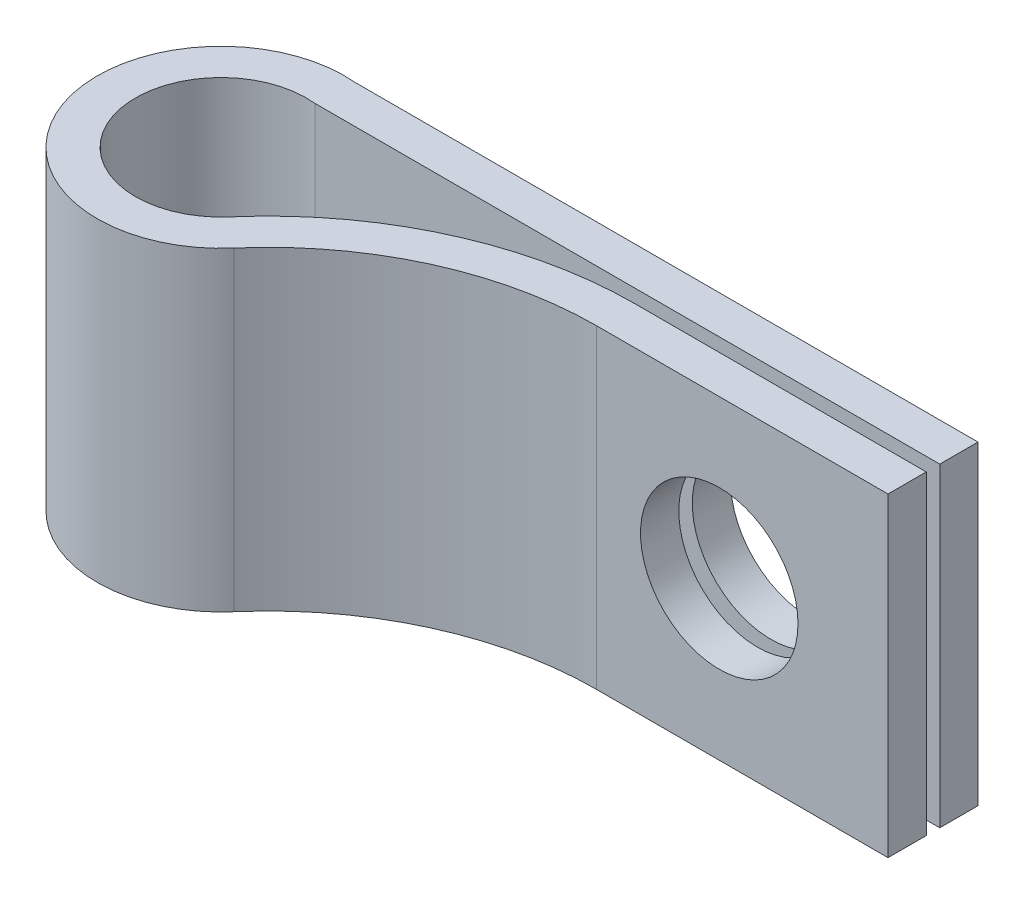
ISO-10303-21;
HEADER;
FILE_DESCRIPTION(('STEP AP214'),'2;1');
FILE_NAME('part.step','',(''),(''),'','','');
FILE_SCHEMA(('AUTOMOTIVE_DESIGN { 1 0 10303 214 1 1 1 1 }'));
ENDSEC;
DATA;
#1=APPLICATION_CONTEXT('core data for automotive mechanical design processes');
#2=APPLICATION_PROTOCOL_DEFINITION('international standard','automotive_design',2000,#1);
#3=PRODUCT_CONTEXT('',#1,'mechanical');
#4=PRODUCT('Part','Part','',(#3));
#5=PRODUCT_RELATED_PRODUCT_CATEGORY('part','',(#4));
#6=PRODUCT_DEFINITION_FORMATION('','',#4);
#7=PRODUCT_DEFINITION_CONTEXT('part definition',#1,'design');
#8=PRODUCT_DEFINITION('design','',#6,#7);
#9=PRODUCT_DEFINITION_SHAPE('','',#8);
#10=(LENGTH_UNIT() NAMED_UNIT(*) SI_UNIT(.MILLI.,.METRE.));
#11=(NAMED_UNIT(*) PLANE_ANGLE_UNIT() SI_UNIT($,.RADIAN.));
#12=(NAMED_UNIT(*) SI_UNIT($,.STERADIAN.) SOLID_ANGLE_UNIT());
#13=UNCERTAINTY_MEASURE_WITH_UNIT(LENGTH_MEASURE(1.E-05),#10,'distance_accuracy_value','');
#14=(GEOMETRIC_REPRESENTATION_CONTEXT(3) GLOBAL_UNCERTAINTY_ASSIGNED_CONTEXT((#13)) GLOBAL_UNIT_ASSIGNED_CONTEXT((#10,
#11,#12)) REPRESENTATION_CONTEXT('',''));
#15=CARTESIAN_POINT('',(0.,0.,0.));
#16=DIRECTION('',(0.,0.,1.));
#17=DIRECTION('',(1.,0.,0.));
#18=AXIS2_PLACEMENT_3D('',#15,#16,#17);
#19=CARTESIAN_POINT('',(25.654,8.89,0.));
#20=DIRECTION('',(0.,0.,1.));
#21=DIRECTION('',(1.,0.,0.));
#22=AXIS2_PLACEMENT_3D('',#19,#20,#21);
#23=CYLINDRICAL_SURFACE('',#22,4.445);
#24=CARTESIAN_POINT('',(25.654,8.89,0.));
#25=DIRECTION('',(0.,0.,1.));
#26=DIRECTION('',(1.,0.,0.));
#27=AXIS2_PLACEMENT_3D('',#24,#25,#26);
#28=CIRCLE('',#27,4.445);
#29=CARTESIAN_POINT('',(30.099,8.89,0.));
#30=VERTEX_POINT('',#29);
#31=EDGE_CURVE('E170',#30,#30,#28,.F.);
#32=ORIENTED_EDGE('',*,*,#31,.T.);
#33=EDGE_LOOP('',(#32));
#34=FACE_BOUND('',#33,.T.);
#35=CARTESIAN_POINT('',(25.654,8.89,2.159));
#36=DIRECTION('',(0.,0.,1.));
#37=DIRECTION('',(1.,0.,0.));
#38=AXIS2_PLACEMENT_3D('',#35,#36,#37);
#39=CIRCLE('',#38,4.445);
#40=CARTESIAN_POINT('',(30.099,8.89,2.159));
#41=VERTEX_POINT('',#40);
#42=EDGE_CURVE('E20',#41,#41,#39,.T.);
#43=ORIENTED_EDGE('',*,*,#42,.T.);
#44=EDGE_LOOP('',(#43));
#45=FACE_BOUND('',#44,.T.);
#46=ADVANCED_FACE('F16',(#34,#45),#23,.F.);
#47=CARTESIAN_POINT('',(-0.5990228304,17.78,6.9592669552));
#48=DIRECTION('',(0.,-1.,0.));
#49=DIRECTION('',(0.,0.,-1.));
#50=AXIS2_PLACEMENT_3D('',#47,#48,#49);
#51=CYLINDRICAL_SURFACE('',#50,6.985);
#52=CARTESIAN_POINT('',(-0.5990228304,17.78,6.9592669552));
#53=DIRECTION('',(0.,-1.,0.));
#54=DIRECTION('',(0.,0.,-1.));
#55=AXIS2_PLACEMENT_3D('',#52,#53,#54);
#56=CIRCLE('',#55,6.985);
#57=CARTESIAN_POINT('',(5.35499259952249E-09,17.78,-2.94893926985895E-09));
#58=VERTEX_POINT('',#57);
#59=CARTESIAN_POINT('',(4.69328394922614,17.78,11.5179634694039));
#60=VERTEX_POINT('',#59);
#61=EDGE_CURVE('E185',#58,#60,#56,.F.);
#62=ORIENTED_EDGE('',*,*,#61,.F.);
#63=DIRECTION('',(0.,-1.,0.));
#64=VECTOR('',#63,1.);
#65=CARTESIAN_POINT('',(0.,8.89,0.));
#66=LINE('',#65,#64);
#67=CARTESIAN_POINT('',(5.35499259952249E-09,0.,-2.94893926985895E-09));
#68=VERTEX_POINT('',#67);
#69=EDGE_CURVE('E167',#58,#68,#66,.T.);
#70=ORIENTED_EDGE('',*,*,#69,.T.);
#71=CARTESIAN_POINT('',(-0.5990228304,0.,6.9592669552));
#72=DIRECTION('',(0.,-1.,0.));
#73=DIRECTION('',(0.,0.,-1.));
#74=AXIS2_PLACEMENT_3D('',#71,#72,#73);
#75=CIRCLE('',#74,6.985);
#76=CARTESIAN_POINT('',(4.69328394696405,0.,11.5179634674554));
#77=VERTEX_POINT('',#76);
#78=EDGE_CURVE('E143',#68,#77,#75,.F.);
#79=ORIENTED_EDGE('',*,*,#78,.T.);
#80=DIRECTION('',(0.,1.,0.));
#81=VECTOR('',#80,1.);
#82=CARTESIAN_POINT('',(4.69328394045269,8.89,11.5179634750146));
#83=LINE('',#82,#81);
#84=EDGE_CURVE('E183',#60,#77,#83,.F.);
#85=ORIENTED_EDGE('',*,*,#84,.F.);
#86=EDGE_LOOP('',(#62,#70,#79,#85));
#87=FACE_BOUND('',#86,.T.);
#88=ADVANCED_FACE('F233',(#87),#51,.T.);
#89=CARTESIAN_POINT('',(-0.5990228304,17.78,6.9592669552));
#90=DIRECTION('',(0.,-1.,0.));
#91=DIRECTION('',(0.,0.,-1.));
#92=AXIS2_PLACEMENT_3D('',#89,#90,#91);
#93=CYLINDRICAL_SURFACE('',#92,4.826);
#94=CARTESIAN_POINT('',(-0.5990228304,0.,6.9592669552));
#95=DIRECTION('',(0.,-1.,0.));
#96=DIRECTION('',(0.,0.,-1.));
#97=AXIS2_PLACEMENT_3D('',#94,#95,#96);
#98=CIRCLE('',#97,4.826);
#99=CARTESIAN_POINT('',(3.05748003205322,0.,10.1089118221738));
#100=VERTEX_POINT('',#99);
#101=CARTESIAN_POINT('',(-0.101314967235434,0.,2.15899999882906));
#102=VERTEX_POINT('',#101);
#103=EDGE_CURVE('E91',#100,#102,#98,.T.);
#104=ORIENTED_EDGE('',*,*,#103,.T.);
#105=DIRECTION('',(0.,1.,0.));
#106=VECTOR('',#105,1.);
#107=CARTESIAN_POINT('',(-0.1013149866,8.89,2.159));
#108=LINE('',#107,#106);
#109=CARTESIAN_POINT('',(-0.101314967235434,17.78,2.15899999882906));
#110=VERTEX_POINT('',#109);
#111=EDGE_CURVE('E94',#102,#110,#108,.T.);
#112=ORIENTED_EDGE('',*,*,#111,.T.);
#113=CARTESIAN_POINT('',(-0.5990228304,17.78,6.9592669552));
#114=DIRECTION('',(0.,-1.,0.));
#115=DIRECTION('',(0.,0.,-1.));
#116=AXIS2_PLACEMENT_3D('',#113,#114,#115);
#117=CIRCLE('',#116,4.826);
#118=CARTESIAN_POINT('',(3.05748002979114,17.78,10.1089118202253));
#119=VERTEX_POINT('',#118);
#120=EDGE_CURVE('E197',#119,#110,#117,.T.);
#121=ORIENTED_EDGE('',*,*,#120,.F.);
#122=DIRECTION('',(0.,1.,0.));
#123=VECTOR('',#122,1.);
#124=CARTESIAN_POINT('',(3.05748002252129,8.89,10.1089118286651));
#125=LINE('',#124,#123);
#126=EDGE_CURVE('E97',#119,#100,#125,.F.);
#127=ORIENTED_EDGE('',*,*,#126,.T.);
#128=EDGE_LOOP('',(#104,#112,#121,#127));
#129=FACE_BOUND('',#128,.T.);
#130=ADVANCED_FACE('F93',(#129),#93,.F.);
#131=CARTESIAN_POINT('',(35.179,0.,2.159));
#132=DIRECTION('',(0.,0.,-1.));
#133=DIRECTION('',(-1.,0.,0.));
#134=AXIS2_PLACEMENT_3D('',#131,#132,#133);
#135=PLANE('',#134);
#136=ORIENTED_EDGE('',*,*,#42,.F.);
#137=EDGE_LOOP('',(#136));
#138=FACE_BOUND('',#137,.T.);
#139=DIRECTION('',(0.,1.,0.));
#140=VECTOR('',#139,1.);
#141=CARTESIAN_POINT('',(35.179,8.89,2.159));
#142=LINE('',#141,#140);
#143=CARTESIAN_POINT('',(35.179,0.,2.15899999843875));
#144=VERTEX_POINT('',#143);
#145=CARTESIAN_POINT('',(35.179,17.78,2.15899999843875));
#146=VERTEX_POINT('',#145);
#147=EDGE_CURVE('E174',#144,#146,#142,.T.);
#148=ORIENTED_EDGE('',*,*,#147,.T.);
#149=DIRECTION('',(1.,0.,0.));
#150=VECTOR('',#149,1.);
#151=CARTESIAN_POINT('',(13.6691995221,17.78,2.15899999765812));
#152=LINE('',#151,#150);
#153=EDGE_CURVE('E107',#110,#146,#152,.T.);
#154=ORIENTED_EDGE('',*,*,#153,.F.);
#155=ORIENTED_EDGE('',*,*,#111,.F.);
#156=DIRECTION('',(1.,0.,0.));
#157=VECTOR('',#156,1.);
#158=CARTESIAN_POINT('',(13.6691995221,0.,2.15899999765812));
#159=LINE('',#158,#157);
#160=EDGE_CURVE('E100',#102,#144,#159,.T.);
#161=ORIENTED_EDGE('',*,*,#160,.T.);
#162=EDGE_LOOP('',(#148,#154,#155,#161));
#163=FACE_BOUND('',#162,.T.);
#164=ADVANCED_FACE('F106',(#138,#163),#135,.F.);
#165=CARTESIAN_POINT('',(35.179,0.,0.));
#166=DIRECTION('',(-1.,0.,0.));
#167=DIRECTION('',(0.,0.,1.));
#168=AXIS2_PLACEMENT_3D('',#165,#166,#167);
#169=PLANE('',#168);
#170=DIRECTION('',(0.,1.,0.));
#171=VECTOR('',#170,1.);
#172=CARTESIAN_POINT('',(35.179,8.89,0.));
#173=LINE('',#172,#171);
#174=CARTESIAN_POINT('',(35.179,0.,-3.93192071602699E-09));
#175=VERTEX_POINT('',#174);
#176=CARTESIAN_POINT('',(35.179,17.78,-2.94894052572647E-09));
#177=VERTEX_POINT('',#176);
#178=EDGE_CURVE('E171',#175,#177,#173,.T.);
#179=ORIENTED_EDGE('',*,*,#178,.T.);
#180=DIRECTION('',(0.,0.,-1.));
#181=VECTOR('',#180,1.);
#182=CARTESIAN_POINT('',(35.179,17.78,6.9592669552));
#183=LINE('',#182,#181);
#184=EDGE_CURVE('E186',#146,#177,#183,.T.);
#185=ORIENTED_EDGE('',*,*,#184,.F.);
#186=ORIENTED_EDGE('',*,*,#147,.F.);
#187=DIRECTION('',(0.,0.,-1.));
#188=VECTOR('',#187,1.);
#189=CARTESIAN_POINT('',(35.179,0.,6.9592669552));
#190=LINE('',#189,#188);
#191=EDGE_CURVE('E113',#144,#175,#190,.T.);
#192=ORIENTED_EDGE('',*,*,#191,.T.);
#193=EDGE_LOOP('',(#179,#185,#186,#192));
#194=FACE_BOUND('',#193,.T.);
#195=ADVANCED_FACE('F214',(#194),#169,.F.);
#196=CARTESIAN_POINT('',(0.,0.,0.));
#197=DIRECTION('',(0.,0.,1.));
#198=DIRECTION('',(1.,0.,0.));
#199=AXIS2_PLACEMENT_3D('',#196,#197,#198);
#200=PLANE('',#199);
#201=ORIENTED_EDGE('',*,*,#31,.F.);
#202=EDGE_LOOP('',(#201));
#203=FACE_BOUND('',#202,.T.);
#204=ORIENTED_EDGE('',*,*,#69,.F.);
#205=DIRECTION('',(-1.,0.,0.));
#206=VECTOR('',#205,1.);
#207=CARTESIAN_POINT('',(13.6691995221,17.78,-5.89788000339084E-09));
#208=LINE('',#207,#206);
#209=EDGE_CURVE('E144',#177,#58,#208,.T.);
#210=ORIENTED_EDGE('',*,*,#209,.F.);
#211=ORIENTED_EDGE('',*,*,#178,.F.);
#212=DIRECTION('',(-1.,0.,0.));
#213=VECTOR('',#212,1.);
#214=CARTESIAN_POINT('',(13.6691995221,0.,-5.89788000339084E-09));
#215=LINE('',#214,#213);
#216=EDGE_CURVE('E115',#175,#68,#215,.T.);
#217=ORIENTED_EDGE('',*,*,#216,.T.);
#218=EDGE_LOOP('',(#204,#210,#211,#217));
#219=FACE_BOUND('',#218,.T.);
#220=ADVANCED_FACE('F210',(#203,#219),#200,.F.);
#221=CARTESIAN_POINT('',(18.735912109,17.78,23.6140271432));
#222=DIRECTION('',(0.,-1.,0.));
#223=DIRECTION('',(0.,0.,-1.));
#224=AXIS2_PLACEMENT_3D('',#221,#222,#223);
#225=CYLINDRICAL_SURFACE('',#224,20.6930271432);
#226=ORIENTED_EDGE('',*,*,#126,.F.);
#227=CARTESIAN_POINT('',(18.735912109,17.78,23.6140271432));
#228=DIRECTION('',(0.,-1.,0.));
#229=DIRECTION('',(0.,0.,-1.));
#230=AXIS2_PLACEMENT_3D('',#227,#228,#229);
#231=CIRCLE('',#230,20.6930271432);
#232=CARTESIAN_POINT('',(18.735912109,17.78,2.921));
#233=VERTEX_POINT('',#232);
#234=EDGE_CURVE('E200',#233,#119,#231,.F.);
#235=ORIENTED_EDGE('',*,*,#234,.F.);
#236=DIRECTION('',(0.,-1.,0.));
#237=VECTOR('',#236,1.);
#238=CARTESIAN_POINT('',(18.735912109,8.89,2.921));
#239=LINE('',#238,#237);
#240=CARTESIAN_POINT('',(18.735912109,0.,2.921));
#241=VERTEX_POINT('',#240);
#242=EDGE_CURVE('E151',#233,#241,#239,.T.);
#243=ORIENTED_EDGE('',*,*,#242,.T.);
#244=CARTESIAN_POINT('',(18.735912109,0.,23.6140271432));
#245=DIRECTION('',(0.,-1.,0.));
#246=DIRECTION('',(0.,0.,-1.));
#247=AXIS2_PLACEMENT_3D('',#244,#245,#246);
#248=CIRCLE('',#247,20.6930271432);
#249=EDGE_CURVE('E101',#241,#100,#248,.F.);
#250=ORIENTED_EDGE('',*,*,#249,.T.);
#251=EDGE_LOOP('',(#226,#235,#243,#250));
#252=FACE_BOUND('',#251,.T.);
#253=ADVANCED_FACE('F213',(#252),#225,.T.);
#254=CARTESIAN_POINT('',(18.735912109,17.78,23.6140271432));
#255=DIRECTION('',(0.,-1.,0.));
#256=DIRECTION('',(0.,0.,-1.));
#257=AXIS2_PLACEMENT_3D('',#254,#255,#256);
#258=CYLINDRICAL_SURFACE('',#257,18.5340271432);
#259=CARTESIAN_POINT('',(18.735912109,17.78,23.6140271432));
#260=DIRECTION('',(0.,-1.,0.));
#261=DIRECTION('',(0.,0.,-1.));
#262=AXIS2_PLACEMENT_3D('',#259,#260,#261);
#263=CIRCLE('',#262,18.5340271432);
#264=CARTESIAN_POINT('',(18.735912109,17.78,5.08));
#265=VERTEX_POINT('',#264);
#266=EDGE_CURVE('E203',#60,#265,#263,.T.);
#267=ORIENTED_EDGE('',*,*,#266,.F.);
#268=ORIENTED_EDGE('',*,*,#84,.T.);
#269=CARTESIAN_POINT('',(18.735912109,0.,23.6140271432));
#270=DIRECTION('',(0.,-1.,0.));
#271=DIRECTION('',(0.,0.,-1.));
#272=AXIS2_PLACEMENT_3D('',#269,#270,#271);
#273=CIRCLE('',#272,18.5340271432);
#274=CARTESIAN_POINT('',(18.735912109,0.,5.08));
#275=VERTEX_POINT('',#274);
#276=EDGE_CURVE('E134',#77,#275,#273,.T.);
#277=ORIENTED_EDGE('',*,*,#276,.T.);
#278=DIRECTION('',(0.,1.,0.));
#279=VECTOR('',#278,1.);
#280=CARTESIAN_POINT('',(18.735912109,8.89,5.08));
#281=LINE('',#280,#279);
#282=EDGE_CURVE('E123',#275,#265,#281,.T.);
#283=ORIENTED_EDGE('',*,*,#282,.T.);
#284=EDGE_LOOP('',(#267,#268,#277,#283));
#285=FACE_BOUND('',#284,.T.);
#286=ADVANCED_FACE('F236',(#285),#258,.F.);
#287=CARTESIAN_POINT('',(-7.8406009558,17.78,-0.1095530448));
#288=DIRECTION('',(0.,1.,0.));
#289=DIRECTION('',(0.,0.,1.));
#290=AXIS2_PLACEMENT_3D('',#287,#288,#289);
#291=PLANE('',#290);
#292=ORIENTED_EDGE('',*,*,#184,.T.);
#293=ORIENTED_EDGE('',*,*,#209,.T.);
#294=ORIENTED_EDGE('',*,*,#61,.T.);
#295=ORIENTED_EDGE('',*,*,#266,.T.);
#296=DIRECTION('',(1.,0.,0.));
#297=VECTOR('',#296,1.);
#298=CARTESIAN_POINT('',(26.9574560545,17.78,5.08));
#299=LINE('',#298,#297);
#300=CARTESIAN_POINT('',(35.179,17.78,5.08));
#301=VERTEX_POINT('',#300);
#302=EDGE_CURVE('E126',#265,#301,#299,.T.);
#303=ORIENTED_EDGE('',*,*,#302,.T.);
#304=DIRECTION('',(0.,0.,-1.));
#305=VECTOR('',#304,1.);
#306=CARTESIAN_POINT('',(35.179,17.78,4.0005));
#307=LINE('',#306,#305);
#308=CARTESIAN_POINT('',(35.179,17.78,2.921));
#309=VERTEX_POINT('',#308);
#310=EDGE_CURVE('E141',#301,#309,#307,.T.);
#311=ORIENTED_EDGE('',*,*,#310,.T.);
#312=DIRECTION('',(-1.,0.,0.));
#313=VECTOR('',#312,1.);
#314=CARTESIAN_POINT('',(26.9574560545,17.78,2.921));
#315=LINE('',#314,#313);
#316=EDGE_CURVE('E154',#309,#233,#315,.T.);
#317=ORIENTED_EDGE('',*,*,#316,.T.);
#318=ORIENTED_EDGE('',*,*,#234,.T.);
#319=ORIENTED_EDGE('',*,*,#120,.T.);
#320=ORIENTED_EDGE('',*,*,#153,.T.);
#321=EDGE_LOOP('',(#292,#293,#294,#295,#303,#311,#317,#318,#319,#320));
#322=FACE_BOUND('',#321,.T.);
#323=ADVANCED_FACE('F222',(#322),#291,.T.);
#324=CARTESIAN_POINT('',(35.179,0.,2.921));
#325=DIRECTION('',(-1.,0.,0.));
#326=DIRECTION('',(0.,0.,1.));
#327=AXIS2_PLACEMENT_3D('',#324,#325,#326);
#328=PLANE('',#327);
#329=DIRECTION('',(0.,1.,0.));
#330=VECTOR('',#329,1.);
#331=CARTESIAN_POINT('',(35.179,8.89,2.921));
#332=LINE('',#331,#330);
#333=CARTESIAN_POINT('',(35.179,0.,2.92099999686564));
#334=VERTEX_POINT('',#333);
#335=EDGE_CURVE('E158',#334,#309,#332,.T.);
#336=ORIENTED_EDGE('',*,*,#335,.T.);
#337=ORIENTED_EDGE('',*,*,#310,.F.);
#338=DIRECTION('',(0.,-1.,0.));
#339=VECTOR('',#338,1.);
#340=CARTESIAN_POINT('',(35.179,8.89,5.08));
#341=LINE('',#340,#339);
#342=CARTESIAN_POINT('',(35.179,0.,5.08));
#343=VERTEX_POINT('',#342);
#344=EDGE_CURVE('E130',#301,#343,#341,.T.);
#345=ORIENTED_EDGE('',*,*,#344,.T.);
#346=DIRECTION('',(0.,0.,-1.));
#347=VECTOR('',#346,1.);
#348=CARTESIAN_POINT('',(35.179,0.,6.9592669552));
#349=LINE('',#348,#347);
#350=EDGE_CURVE('E35',#343,#334,#349,.T.);
#351=ORIENTED_EDGE('',*,*,#350,.T.);
#352=EDGE_LOOP('',(#336,#337,#345,#351));
#353=FACE_BOUND('',#352,.T.);
#354=ADVANCED_FACE('F241',(#353),#328,.F.);
#355=CARTESIAN_POINT('',(-7.8406009558,0.,-0.1095530448));
#356=DIRECTION('',(0.,1.,0.));
#357=DIRECTION('',(0.,0.,1.));
#358=AXIS2_PLACEMENT_3D('',#355,#356,#357);
#359=PLANE('',#358);
#360=ORIENTED_EDGE('',*,*,#216,.F.);
#361=ORIENTED_EDGE('',*,*,#191,.F.);
#362=ORIENTED_EDGE('',*,*,#160,.F.);
#363=ORIENTED_EDGE('',*,*,#103,.F.);
#364=ORIENTED_EDGE('',*,*,#249,.F.);
#365=DIRECTION('',(1.,0.,0.));
#366=VECTOR('',#365,1.);
#367=CARTESIAN_POINT('',(26.9574560545,0.,2.921));
#368=LINE('',#367,#366);
#369=EDGE_CURVE('E127',#241,#334,#368,.T.);
#370=ORIENTED_EDGE('',*,*,#369,.T.);
#371=ORIENTED_EDGE('',*,*,#350,.F.);
#372=DIRECTION('',(-1.,0.,0.));
#373=VECTOR('',#372,1.);
#374=CARTESIAN_POINT('',(26.9574560545,0.,5.08));
#375=LINE('',#374,#373);
#376=EDGE_CURVE('E128',#343,#275,#375,.T.);
#377=ORIENTED_EDGE('',*,*,#376,.T.);
#378=ORIENTED_EDGE('',*,*,#276,.F.);
#379=ORIENTED_EDGE('',*,*,#78,.F.);
#380=EDGE_LOOP('',(#360,#361,#362,#363,#364,#370,#371,#377,#378,#379));
#381=FACE_BOUND('',#380,.T.);
#382=ADVANCED_FACE('F111',(#381),#359,.F.);
#383=CARTESIAN_POINT('',(18.735912109,0.,2.921));
#384=DIRECTION('',(0.,0.,1.));
#385=DIRECTION('',(1.,0.,0.));
#386=AXIS2_PLACEMENT_3D('',#383,#384,#385);
#387=PLANE('',#386);
#388=CARTESIAN_POINT('',(25.654,8.89,2.921));
#389=DIRECTION('',(0.,0.,1.));
#390=DIRECTION('',(1.,0.,0.));
#391=AXIS2_PLACEMENT_3D('',#388,#389,#390);
#392=CIRCLE('',#391,4.445);
#393=CARTESIAN_POINT('',(30.099,8.89,2.921));
#394=VERTEX_POINT('',#393);
#395=EDGE_CURVE('E26',#394,#394,#392,.F.);
#396=ORIENTED_EDGE('',*,*,#395,.F.);
#397=EDGE_LOOP('',(#396));
#398=FACE_BOUND('',#397,.T.);
#399=ORIENTED_EDGE('',*,*,#242,.F.);
#400=ORIENTED_EDGE('',*,*,#316,.F.);
#401=ORIENTED_EDGE('',*,*,#335,.F.);
#402=ORIENTED_EDGE('',*,*,#369,.F.);
#403=EDGE_LOOP('',(#399,#400,#401,#402));
#404=FACE_BOUND('',#403,.T.);
#405=ADVANCED_FACE('F246',(#398,#404),#387,.F.);
#406=CARTESIAN_POINT('',(35.179,0.,5.08));
#407=DIRECTION('',(0.,0.,-1.));
#408=DIRECTION('',(-1.,0.,0.));
#409=AXIS2_PLACEMENT_3D('',#406,#407,#408);
#410=PLANE('',#409);
#411=CARTESIAN_POINT('',(25.654,8.89,5.08));
#412=DIRECTION('',(0.,0.,1.));
#413=DIRECTION('',(1.,0.,0.));
#414=AXIS2_PLACEMENT_3D('',#411,#412,#413);
#415=CIRCLE('',#414,4.445);
#416=CARTESIAN_POINT('',(30.099,8.89,5.08));
#417=VERTEX_POINT('',#416);
#418=EDGE_CURVE('E10',#417,#417,#415,.T.);
#419=ORIENTED_EDGE('',*,*,#418,.F.);
#420=EDGE_LOOP('',(#419));
#421=FACE_BOUND('',#420,.T.);
#422=ORIENTED_EDGE('',*,*,#344,.F.);
#423=ORIENTED_EDGE('',*,*,#302,.F.);
#424=ORIENTED_EDGE('',*,*,#282,.F.);
#425=ORIENTED_EDGE('',*,*,#376,.F.);
#426=EDGE_LOOP('',(#422,#423,#424,#425));
#427=FACE_BOUND('',#426,.T.);
#428=ADVANCED_FACE('F18',(#421,#427),#410,.F.);
#429=CARTESIAN_POINT('',(25.654,8.89,2.921));
#430=DIRECTION('',(0.,0.,1.));
#431=DIRECTION('',(1.,0.,0.));
#432=AXIS2_PLACEMENT_3D('',#429,#430,#431);
#433=CYLINDRICAL_SURFACE('',#432,4.445);
#434=ORIENTED_EDGE('',*,*,#418,.T.);
#435=EDGE_LOOP('',(#434));
#436=FACE_BOUND('',#435,.T.);
#437=ORIENTED_EDGE('',*,*,#395,.T.);
#438=EDGE_LOOP('',(#437));
#439=FACE_BOUND('',#438,.T.);
#440=ADVANCED_FACE('F256',(#436,#439),#433,.F.);
#441=CLOSED_SHELL('',(#46,#88,#130,#164,#195,#220,#253,#286,#323,#354,#382,#405,#428,#440));
#442=MANIFOLD_SOLID_BREP('B1',#441);
#443=ADVANCED_BREP_SHAPE_REPRESENTATION('',(#18,#442),#14);
#444=SHAPE_DEFINITION_REPRESENTATION(#9,#443);
ENDSEC;
END-ISO-10303-21;
